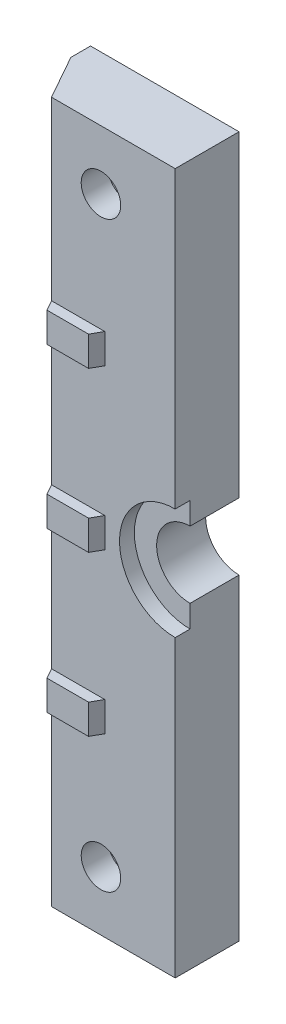
ISO-10303-21;
HEADER;
FILE_DESCRIPTION(('STEP AP214'),'2;1');
FILE_NAME('part.step','',(''),(''),'','','');
FILE_SCHEMA(('AUTOMOTIVE_DESIGN { 1 0 10303 214 1 1 1 1 }'));
ENDSEC;
DATA;
#1=APPLICATION_CONTEXT('core data for automotive mechanical design processes');
#2=APPLICATION_PROTOCOL_DEFINITION('international standard','automotive_design',2000,#1);
#3=PRODUCT_CONTEXT('',#1,'mechanical');
#4=PRODUCT('Part','Part','',(#3));
#5=PRODUCT_RELATED_PRODUCT_CATEGORY('part','',(#4));
#6=PRODUCT_DEFINITION_FORMATION('','',#4);
#7=PRODUCT_DEFINITION_CONTEXT('part definition',#1,'design');
#8=PRODUCT_DEFINITION('design','',#6,#7);
#9=PRODUCT_DEFINITION_SHAPE('','',#8);
#10=(LENGTH_UNIT() NAMED_UNIT(*) SI_UNIT(.MILLI.,.METRE.));
#11=(NAMED_UNIT(*) PLANE_ANGLE_UNIT() SI_UNIT($,.RADIAN.));
#12=(NAMED_UNIT(*) SI_UNIT($,.STERADIAN.) SOLID_ANGLE_UNIT());
#13=UNCERTAINTY_MEASURE_WITH_UNIT(LENGTH_MEASURE(1.E-05),#10,'distance_accuracy_value','');
#14=(GEOMETRIC_REPRESENTATION_CONTEXT(3) GLOBAL_UNCERTAINTY_ASSIGNED_CONTEXT((#13)) GLOBAL_UNIT_ASSIGNED_CONTEXT((#10,
#11,#12)) REPRESENTATION_CONTEXT('',''));
#15=CARTESIAN_POINT('',(0.,0.,0.));
#16=DIRECTION('',(0.,0.,1.));
#17=DIRECTION('',(1.,0.,0.));
#18=AXIS2_PLACEMENT_3D('',#15,#16,#17);
#19=CARTESIAN_POINT('',(0.,59.944,0.));
#20=DIRECTION('',(0.,0.,-1.));
#21=DIRECTION('',(-1.,0.,0.));
#22=AXIS2_PLACEMENT_3D('',#19,#20,#21);
#23=CYLINDRICAL_SURFACE('',#22,5.715);
#24=CARTESIAN_POINT('',(0.,59.944,-2.54));
#25=DIRECTION('',(0.,0.,1.));
#26=DIRECTION('',(1.,0.,0.));
#27=AXIS2_PLACEMENT_3D('',#24,#25,#26);
#28=CIRCLE('',#27,5.715);
#29=CARTESIAN_POINT('',(0.,54.229,-2.54));
#30=VERTEX_POINT('',#29);
#31=CARTESIAN_POINT('',(0.,65.659,-2.54));
#32=VERTEX_POINT('',#31);
#33=EDGE_CURVE('E54',#30,#32,#28,.F.);
#34=ORIENTED_EDGE('',*,*,#33,.F.);
#35=DIRECTION('',(0.,0.,-1.));
#36=VECTOR('',#35,1.);
#37=CARTESIAN_POINT('',(0.,54.229,0.));
#38=LINE('',#37,#36);
#39=CARTESIAN_POINT('',(0.,54.229,-10.922));
#40=VERTEX_POINT('',#39);
#41=EDGE_CURVE('E237',#40,#30,#38,.F.);
#42=ORIENTED_EDGE('',*,*,#41,.F.);
#43=CARTESIAN_POINT('',(0.,59.944,-10.922));
#44=DIRECTION('',(0.,0.,1.));
#45=DIRECTION('',(1.,0.,0.));
#46=AXIS2_PLACEMENT_3D('',#43,#44,#45);
#47=CIRCLE('',#46,5.715);
#48=CARTESIAN_POINT('',(0.,65.659,-10.922));
#49=VERTEX_POINT('',#48);
#50=EDGE_CURVE('E216',#49,#40,#47,.T.);
#51=ORIENTED_EDGE('',*,*,#50,.F.);
#52=DIRECTION('',(0.,0.,-1.));
#53=VECTOR('',#52,1.);
#54=CARTESIAN_POINT('',(0.,65.659,0.));
#55=LINE('',#54,#53);
#56=EDGE_CURVE('E230',#32,#49,#55,.T.);
#57=ORIENTED_EDGE('',*,*,#56,.F.);
#58=EDGE_LOOP('',(#34,#42,#51,#57));
#59=FACE_BOUND('',#58,.T.);
#60=ADVANCED_FACE('F45',(#59),#23,.F.);
#61=CARTESIAN_POINT('',(-21.1556739347085,119.888,0.));
#62=DIRECTION('',(0.,0.,-1.));
#63=DIRECTION('',(-1.,0.,0.));
#64=AXIS2_PLACEMENT_3D('',#61,#62,#63);
#65=PLANE('',#64);
#66=CARTESIAN_POINT('',(-12.7,109.77245,0.));
#67=DIRECTION('',(0.,0.,-1.));
#68=DIRECTION('',(-1.,0.,0.));
#69=AXIS2_PLACEMENT_3D('',#66,#67,#68);
#70=CIRCLE('',#69,3.3782);
#71=CARTESIAN_POINT('',(-16.0782,109.77245,0.));
#72=VERTEX_POINT('',#71);
#73=EDGE_CURVE('E271',#72,#72,#70,.T.);
#74=ORIENTED_EDGE('',*,*,#73,.T.);
#75=EDGE_LOOP('',(#74));
#76=FACE_BOUND('',#75,.T.);
#77=CARTESIAN_POINT('',(-12.7,10.11555,0.));
#78=DIRECTION('',(0.,0.,-1.));
#79=DIRECTION('',(-1.,0.,0.));
#80=AXIS2_PLACEMENT_3D('',#77,#78,#79);
#81=CIRCLE('',#80,3.3782);
#82=CARTESIAN_POINT('',(-16.0782,10.11555,0.));
#83=VERTEX_POINT('',#82);
#84=EDGE_CURVE('E255',#83,#83,#81,.T.);
#85=ORIENTED_EDGE('',*,*,#84,.T.);
#86=EDGE_LOOP('',(#85));
#87=FACE_BOUND('',#86,.T.);
#88=DIRECTION('',(0.,-1.,0.));
#89=VECTOR('',#88,1.);
#90=CARTESIAN_POINT('',(0.,119.888,0.));
#91=LINE('',#90,#89);
#92=CARTESIAN_POINT('',(0.,50.419,0.));
#93=VERTEX_POINT('',#92);
#94=CARTESIAN_POINT('',(0.,0.,0.));
#95=VERTEX_POINT('',#94);
#96=EDGE_CURVE('E208',#93,#95,#91,.T.);
#97=ORIENTED_EDGE('',*,*,#96,.F.);
#98=CARTESIAN_POINT('',(0.,59.944,0.));
#99=DIRECTION('',(0.,0.,1.));
#100=DIRECTION('',(1.,0.,0.));
#101=AXIS2_PLACEMENT_3D('',#98,#99,#100);
#102=CIRCLE('',#101,9.525);
#103=CARTESIAN_POINT('',(0.,69.469,0.));
#104=VERTEX_POINT('',#103);
#105=EDGE_CURVE('E194',#104,#93,#102,.T.);
#106=ORIENTED_EDGE('',*,*,#105,.F.);
#107=CARTESIAN_POINT('',(0.,119.888,0.));
#108=VERTEX_POINT('',#107);
#109=EDGE_CURVE('E206',#108,#104,#91,.T.);
#110=ORIENTED_EDGE('',*,*,#109,.F.);
#111=DIRECTION('',(1.,0.,0.));
#112=VECTOR('',#111,1.);
#113=CARTESIAN_POINT('',(-21.1556739347085,119.888,0.));
#114=LINE('',#113,#112);
#115=CARTESIAN_POINT('',(-21.1556739347085,119.888,0.));
#116=VERTEX_POINT('',#115);
#117=EDGE_CURVE('E276',#116,#108,#114,.T.);
#118=ORIENTED_EDGE('',*,*,#117,.F.);
#119=DIRECTION('',(0.,-1.,0.));
#120=VECTOR('',#119,1.);
#121=CARTESIAN_POINT('',(-21.1556739347085,119.888,0.));
#122=LINE('',#121,#120);
#123=CARTESIAN_POINT('',(-21.1556739347085,89.7382,0.));
#124=VERTEX_POINT('',#123);
#125=EDGE_CURVE('E307',#116,#124,#122,.T.);
#126=ORIENTED_EDGE('',*,*,#125,.T.);
#127=DIRECTION('',(-1.,0.,0.));
#128=VECTOR('',#127,1.);
#129=CARTESIAN_POINT('',(-21.1556739347085,89.7382,0.));
#130=LINE('',#129,#128);
#131=CARTESIAN_POINT('',(-12.0463440216302,89.7382,0.));
#132=VERTEX_POINT('',#131);
#133=EDGE_CURVE('E336',#132,#124,#130,.T.);
#134=ORIENTED_EDGE('',*,*,#133,.F.);
#135=DIRECTION('',(0.,1.,0.));
#136=VECTOR('',#135,1.);
#137=CARTESIAN_POINT('',(-12.0463440216302,84.6582,0.));
#138=LINE('',#137,#136);
#139=CARTESIAN_POINT('',(-12.0463440216302,84.6582,0.));
#140=VERTEX_POINT('',#139);
#141=EDGE_CURVE('E69',#140,#132,#138,.T.);
#142=ORIENTED_EDGE('',*,*,#141,.F.);
#143=DIRECTION('',(-1.,0.,0.));
#144=VECTOR('',#143,1.);
#145=CARTESIAN_POINT('',(-21.1556739347085,84.6582,0.));
#146=LINE('',#145,#144);
#147=CARTESIAN_POINT('',(-21.1556739347085,84.6582,0.));
#148=VERTEX_POINT('',#147);
#149=EDGE_CURVE('E365',#140,#148,#146,.T.);
#150=ORIENTED_EDGE('',*,*,#149,.T.);
#151=CARTESIAN_POINT('',(-21.1556739347085,62.484,0.));
#152=VERTEX_POINT('',#151);
#153=EDGE_CURVE('E311',#148,#152,#122,.T.);
#154=ORIENTED_EDGE('',*,*,#153,.T.);
#155=DIRECTION('',(-1.,0.,0.));
#156=VECTOR('',#155,1.);
#157=CARTESIAN_POINT('',(-21.1556739347085,62.484,0.));
#158=LINE('',#157,#156);
#159=CARTESIAN_POINT('',(-12.0463440216302,62.484,0.));
#160=VERTEX_POINT('',#159);
#161=EDGE_CURVE('E381',#160,#152,#158,.T.);
#162=ORIENTED_EDGE('',*,*,#161,.F.);
#163=DIRECTION('',(0.,1.,0.));
#164=VECTOR('',#163,1.);
#165=CARTESIAN_POINT('',(-12.0463440216302,57.404,0.));
#166=LINE('',#165,#164);
#167=CARTESIAN_POINT('',(-12.0463440216302,57.404,0.));
#168=VERTEX_POINT('',#167);
#169=EDGE_CURVE('E244',#168,#160,#166,.T.);
#170=ORIENTED_EDGE('',*,*,#169,.F.);
#171=DIRECTION('',(-1.,0.,0.));
#172=VECTOR('',#171,1.);
#173=CARTESIAN_POINT('',(-21.1556739347085,57.404,0.));
#174=LINE('',#173,#172);
#175=CARTESIAN_POINT('',(-21.1556739347085,57.404,0.));
#176=VERTEX_POINT('',#175);
#177=EDGE_CURVE('E438',#168,#176,#174,.T.);
#178=ORIENTED_EDGE('',*,*,#177,.T.);
#179=CARTESIAN_POINT('',(-21.1556739347085,35.2298,0.));
#180=VERTEX_POINT('',#179);
#181=EDGE_CURVE('E312',#176,#180,#122,.T.);
#182=ORIENTED_EDGE('',*,*,#181,.T.);
#183=DIRECTION('',(-1.,0.,0.));
#184=VECTOR('',#183,1.);
#185=CARTESIAN_POINT('',(-21.1556739347085,35.2298,0.));
#186=LINE('',#185,#184);
#187=CARTESIAN_POINT('',(-12.0463440216302,35.2298,0.));
#188=VERTEX_POINT('',#187);
#189=EDGE_CURVE('E200',#188,#180,#186,.T.);
#190=ORIENTED_EDGE('',*,*,#189,.F.);
#191=DIRECTION('',(0.,1.,0.));
#192=VECTOR('',#191,1.);
#193=CARTESIAN_POINT('',(-12.0463440216302,30.1498,0.));
#194=LINE('',#193,#192);
#195=CARTESIAN_POINT('',(-12.0463440216302,30.1498,0.));
#196=VERTEX_POINT('',#195);
#197=EDGE_CURVE('E354',#196,#188,#194,.T.);
#198=ORIENTED_EDGE('',*,*,#197,.F.);
#199=DIRECTION('',(-1.,0.,0.));
#200=VECTOR('',#199,1.);
#201=CARTESIAN_POINT('',(-21.1556739347085,30.1498,0.));
#202=LINE('',#201,#200);
#203=CARTESIAN_POINT('',(-21.1556739347085,30.1498,0.));
#204=VERTEX_POINT('',#203);
#205=EDGE_CURVE('E402',#196,#204,#202,.T.);
#206=ORIENTED_EDGE('',*,*,#205,.T.);
#207=CARTESIAN_POINT('',(-21.1556739347085,0.,0.));
#208=VERTEX_POINT('',#207);
#209=EDGE_CURVE('E291',#204,#208,#122,.T.);
#210=ORIENTED_EDGE('',*,*,#209,.T.);
#211=DIRECTION('',(1.,0.,0.));
#212=VECTOR('',#211,1.);
#213=CARTESIAN_POINT('',(-21.1556739347085,0.,0.));
#214=LINE('',#213,#212);
#215=EDGE_CURVE('E275',#208,#95,#214,.T.);
#216=ORIENTED_EDGE('',*,*,#215,.T.);
#217=EDGE_LOOP('',(#97,#106,#110,#118,#126,#134,#142,#150,#154,#162,#170,#178,#182,#190,#198,
#206,#210,#216));
#218=FACE_BOUND('',#217,.T.);
#219=ADVANCED_FACE('F47',(#76,#87,#218),#65,.F.);
#220=CARTESIAN_POINT('',(0.,119.888,0.));
#221=DIRECTION('',(-1.,0.,0.));
#222=DIRECTION('',(0.,0.,1.));
#223=AXIS2_PLACEMENT_3D('',#220,#221,#222);
#224=PLANE('',#223);
#225=ORIENTED_EDGE('',*,*,#109,.T.);
#226=DIRECTION('',(0.,0.,1.));
#227=VECTOR('',#226,1.);
#228=CARTESIAN_POINT('',(0.,69.469,-2.54));
#229=LINE('',#228,#227);
#230=CARTESIAN_POINT('',(0.,69.469,-2.54));
#231=VERTEX_POINT('',#230);
#232=EDGE_CURVE('E191',#104,#231,#229,.F.);
#233=ORIENTED_EDGE('',*,*,#232,.T.);
#234=DIRECTION('',(0.,1.,0.));
#235=VECTOR('',#234,1.);
#236=CARTESIAN_POINT('',(0.,119.888,-2.54));
#237=LINE('',#236,#235);
#238=EDGE_CURVE('E201',#32,#231,#237,.T.);
#239=ORIENTED_EDGE('',*,*,#238,.F.);
#240=ORIENTED_EDGE('',*,*,#56,.T.);
#241=DIRECTION('',(0.,-1.,0.));
#242=VECTOR('',#241,1.);
#243=CARTESIAN_POINT('',(0.,119.888,-10.922));
#244=LINE('',#243,#242);
#245=CARTESIAN_POINT('',(0.,119.888,-10.922));
#246=VERTEX_POINT('',#245);
#247=EDGE_CURVE('E222',#246,#49,#244,.T.);
#248=ORIENTED_EDGE('',*,*,#247,.F.);
#249=DIRECTION('',(0.,0.,-1.));
#250=VECTOR('',#249,1.);
#251=CARTESIAN_POINT('',(0.,119.888,0.));
#252=LINE('',#251,#250);
#253=EDGE_CURVE('E213',#108,#246,#252,.T.);
#254=ORIENTED_EDGE('',*,*,#253,.F.);
#255=EDGE_LOOP('',(#225,#233,#239,#240,#248,#254));
#256=FACE_BOUND('',#255,.T.);
#257=ADVANCED_FACE('F211',(#256),#224,.F.);
#258=DIRECTION('',(0.,1.,0.));
#259=VECTOR('',#258,1.);
#260=CARTESIAN_POINT('',(0.,119.888,-2.54));
#261=LINE('',#260,#259);
#262=CARTESIAN_POINT('',(0.,50.419,-2.54));
#263=VERTEX_POINT('',#262);
#264=EDGE_CURVE('E61',#263,#30,#261,.T.);
#265=ORIENTED_EDGE('',*,*,#264,.F.);
#266=DIRECTION('',(0.,0.,1.));
#267=VECTOR('',#266,1.);
#268=CARTESIAN_POINT('',(0.,50.419,-2.54));
#269=LINE('',#268,#267);
#270=EDGE_CURVE('E11',#263,#93,#269,.T.);
#271=ORIENTED_EDGE('',*,*,#270,.T.);
#272=ORIENTED_EDGE('',*,*,#96,.T.);
#273=DIRECTION('',(0.,0.,-1.));
#274=VECTOR('',#273,1.);
#275=CARTESIAN_POINT('',(0.,0.,0.));
#276=LINE('',#275,#274);
#277=CARTESIAN_POINT('',(0.,0.,-10.922));
#278=VERTEX_POINT('',#277);
#279=EDGE_CURVE('E294',#95,#278,#276,.T.);
#280=ORIENTED_EDGE('',*,*,#279,.T.);
#281=EDGE_CURVE('E318',#40,#278,#244,.T.);
#282=ORIENTED_EDGE('',*,*,#281,.F.);
#283=ORIENTED_EDGE('',*,*,#41,.T.);
#284=EDGE_LOOP('',(#265,#271,#272,#280,#282,#283));
#285=FACE_BOUND('',#284,.T.);
#286=ADVANCED_FACE('F487',(#285),#224,.F.);
#287=CARTESIAN_POINT('',(0.,119.888,-10.922));
#288=DIRECTION('',(0.,0.,1.));
#289=DIRECTION('',(1.,0.,0.));
#290=AXIS2_PLACEMENT_3D('',#287,#288,#289);
#291=PLANE('',#290);
#292=CARTESIAN_POINT('',(-12.7,10.11555,-10.922));
#293=DIRECTION('',(0.,0.,-1.));
#294=DIRECTION('',(-1.,0.,0.));
#295=AXIS2_PLACEMENT_3D('',#292,#293,#294);
#296=CIRCLE('',#295,5.55625);
#297=CARTESIAN_POINT('',(-18.25625,10.11555,-10.922));
#298=VERTEX_POINT('',#297);
#299=EDGE_CURVE('E236',#298,#298,#296,.T.);
#300=ORIENTED_EDGE('',*,*,#299,.F.);
#301=EDGE_LOOP('',(#300));
#302=FACE_BOUND('',#301,.T.);
#303=CARTESIAN_POINT('',(-12.7,109.77245,-10.922));
#304=DIRECTION('',(0.,0.,-1.));
#305=DIRECTION('',(-1.,0.,0.));
#306=AXIS2_PLACEMENT_3D('',#303,#304,#305);
#307=CIRCLE('',#306,5.55625);
#308=CARTESIAN_POINT('',(-18.25625,109.77245,-10.922));
#309=VERTEX_POINT('',#308);
#310=EDGE_CURVE('E259',#309,#309,#307,.T.);
#311=ORIENTED_EDGE('',*,*,#310,.F.);
#312=EDGE_LOOP('',(#311));
#313=FACE_BOUND('',#312,.T.);
#314=ORIENTED_EDGE('',*,*,#247,.T.);
#315=ORIENTED_EDGE('',*,*,#50,.T.);
#316=ORIENTED_EDGE('',*,*,#281,.T.);
#317=DIRECTION('',(-1.,0.,0.));
#318=VECTOR('',#317,1.);
#319=CARTESIAN_POINT('',(0.,0.,-10.922));
#320=LINE('',#319,#318);
#321=CARTESIAN_POINT('',(-25.4,0.,-10.922));
#322=VERTEX_POINT('',#321);
#323=EDGE_CURVE('E298',#278,#322,#320,.T.);
#324=ORIENTED_EDGE('',*,*,#323,.T.);
#325=DIRECTION('',(0.,-1.,0.));
#326=VECTOR('',#325,1.);
#327=CARTESIAN_POINT('',(-25.4,119.888,-10.922));
#328=LINE('',#327,#326);
#329=CARTESIAN_POINT('',(-25.4,119.888,-10.922));
#330=VERTEX_POINT('',#329);
#331=EDGE_CURVE('E315',#330,#322,#328,.T.);
#332=ORIENTED_EDGE('',*,*,#331,.F.);
#333=DIRECTION('',(-1.,0.,0.));
#334=VECTOR('',#333,1.);
#335=CARTESIAN_POINT('',(0.,119.888,-10.922));
#336=LINE('',#335,#334);
#337=EDGE_CURVE('E282',#246,#330,#336,.T.);
#338=ORIENTED_EDGE('',*,*,#337,.F.);
#339=EDGE_LOOP('',(#314,#315,#316,#324,#332,#338));
#340=FACE_BOUND('',#339,.T.);
#341=ADVANCED_FACE('F328',(#302,#313,#340),#291,.F.);
#342=CARTESIAN_POINT('',(-25.4,119.888,-10.922));
#343=DIRECTION('',(1.,0.,0.));
#344=DIRECTION('',(0.,0.,-1.));
#345=AXIS2_PLACEMENT_3D('',#342,#343,#344);
#346=PLANE('',#345);
#347=DIRECTION('',(0.,0.,1.));
#348=VECTOR('',#347,1.);
#349=CARTESIAN_POINT('',(-25.4,0.,-10.922));
#350=LINE('',#349,#348);
#351=CARTESIAN_POINT('',(-25.4,0.,-7.5565));
#352=VERTEX_POINT('',#351);
#353=EDGE_CURVE('E301',#322,#352,#350,.T.);
#354=ORIENTED_EDGE('',*,*,#353,.T.);
#355=DIRECTION('',(0.,-1.,0.));
#356=VECTOR('',#355,1.);
#357=CARTESIAN_POINT('',(-25.4,119.888,-7.5565));
#358=LINE('',#357,#356);
#359=CARTESIAN_POINT('',(-25.4,119.888,-7.5565));
#360=VERTEX_POINT('',#359);
#361=EDGE_CURVE('E310',#360,#352,#358,.T.);
#362=ORIENTED_EDGE('',*,*,#361,.F.);
#363=DIRECTION('',(0.,0.,1.));
#364=VECTOR('',#363,1.);
#365=CARTESIAN_POINT('',(-25.4,119.888,-10.922));
#366=LINE('',#365,#364);
#367=EDGE_CURVE('E285',#330,#360,#366,.T.);
#368=ORIENTED_EDGE('',*,*,#367,.F.);
#369=ORIENTED_EDGE('',*,*,#331,.T.);
#370=EDGE_LOOP('',(#354,#362,#368,#369));
#371=FACE_BOUND('',#370,.T.);
#372=ADVANCED_FACE('F498',(#371),#346,.F.);
#373=CARTESIAN_POINT('',(-25.4,119.888,-7.5565));
#374=DIRECTION('',(0.871881298778186,0.,-0.489717266227018));
#375=DIRECTION('',(-0.489717266227018,0.,-0.871881298778186));
#376=AXIS2_PLACEMENT_3D('',#373,#374,#375);
#377=PLANE('',#376);
#378=DIRECTION('',(0.489717266227018,0.,0.871881298778186));
#379=VECTOR('',#378,1.);
#380=CARTESIAN_POINT('',(-25.4,0.,-7.5565));
#381=LINE('',#380,#379);
#382=EDGE_CURVE('E279',#352,#208,#381,.T.);
#383=ORIENTED_EDGE('',*,*,#382,.T.);
#384=ORIENTED_EDGE('',*,*,#209,.F.);
#385=DIRECTION('',(0.489717266227017,0.,0.871881298778186));
#386=VECTOR('',#385,1.);
#387=CARTESIAN_POINT('',(-21.1556739347085,30.1498,0.));
#388=LINE('',#387,#386);
#389=CARTESIAN_POINT('',(-20.1570089781693,30.1498,1.778));
#390=VERTEX_POINT('',#389);
#391=EDGE_CURVE('E406',#204,#390,#388,.T.);
#392=ORIENTED_EDGE('',*,*,#391,.T.);
#393=DIRECTION('',(0.,1.,0.));
#394=VECTOR('',#393,1.);
#395=CARTESIAN_POINT('',(-20.1570089781693,30.1498,1.778));
#396=LINE('',#395,#394);
#397=CARTESIAN_POINT('',(-20.1570089781693,35.2298,1.778));
#398=VERTEX_POINT('',#397);
#399=EDGE_CURVE('E417',#390,#398,#396,.T.);
#400=ORIENTED_EDGE('',*,*,#399,.T.);
#401=DIRECTION('',(0.489717266227017,0.,0.871881298778186));
#402=VECTOR('',#401,1.);
#403=CARTESIAN_POINT('',(-21.1556739347085,35.2298,0.));
#404=LINE('',#403,#402);
#405=EDGE_CURVE('E390',#180,#398,#404,.T.);
#406=ORIENTED_EDGE('',*,*,#405,.F.);
#407=ORIENTED_EDGE('',*,*,#181,.F.);
#408=DIRECTION('',(0.489717266227017,0.,0.871881298778186));
#409=VECTOR('',#408,1.);
#410=CARTESIAN_POINT('',(-21.1556739347085,57.404,0.));
#411=LINE('',#410,#409);
#412=CARTESIAN_POINT('',(-20.1570089781693,57.404,1.778));
#413=VERTEX_POINT('',#412);
#414=EDGE_CURVE('E442',#176,#413,#411,.T.);
#415=ORIENTED_EDGE('',*,*,#414,.T.);
#416=DIRECTION('',(0.,1.,0.));
#417=VECTOR('',#416,1.);
#418=CARTESIAN_POINT('',(-20.1570089781693,57.404,1.778));
#419=LINE('',#418,#417);
#420=CARTESIAN_POINT('',(-20.1570089781693,62.484,1.778));
#421=VERTEX_POINT('',#420);
#422=EDGE_CURVE('E454',#413,#421,#419,.T.);
#423=ORIENTED_EDGE('',*,*,#422,.T.);
#424=DIRECTION('',(0.489717266227017,0.,0.871881298778186));
#425=VECTOR('',#424,1.);
#426=CARTESIAN_POINT('',(-21.1556739347085,62.484,0.));
#427=LINE('',#426,#425);
#428=EDGE_CURVE('E426',#152,#421,#427,.T.);
#429=ORIENTED_EDGE('',*,*,#428,.F.);
#430=ORIENTED_EDGE('',*,*,#153,.F.);
#431=DIRECTION('',(0.489717266227017,0.,0.871881298778186));
#432=VECTOR('',#431,1.);
#433=CARTESIAN_POINT('',(-21.1556739347085,84.6582,0.));
#434=LINE('',#433,#432);
#435=CARTESIAN_POINT('',(-20.1570089781693,84.6582,1.778));
#436=VERTEX_POINT('',#435);
#437=EDGE_CURVE('E368',#148,#436,#434,.T.);
#438=ORIENTED_EDGE('',*,*,#437,.T.);
#439=DIRECTION('',(0.,1.,0.));
#440=VECTOR('',#439,1.);
#441=CARTESIAN_POINT('',(-20.1570089781693,84.6582,1.778));
#442=LINE('',#441,#440);
#443=CARTESIAN_POINT('',(-20.1570089781693,89.7382,1.778));
#444=VERTEX_POINT('',#443);
#445=EDGE_CURVE('E342',#436,#444,#442,.T.);
#446=ORIENTED_EDGE('',*,*,#445,.T.);
#447=DIRECTION('',(0.489717266227017,0.,0.871881298778186));
#448=VECTOR('',#447,1.);
#449=CARTESIAN_POINT('',(-21.1556739347085,89.7382,0.));
#450=LINE('',#449,#448);
#451=EDGE_CURVE('E339',#124,#444,#450,.T.);
#452=ORIENTED_EDGE('',*,*,#451,.F.);
#453=ORIENTED_EDGE('',*,*,#125,.F.);
#454=DIRECTION('',(0.489717266227018,0.,0.871881298778186));
#455=VECTOR('',#454,1.);
#456=CARTESIAN_POINT('',(-25.4,119.888,-7.5565));
#457=LINE('',#456,#455);
#458=EDGE_CURVE('E288',#360,#116,#457,.T.);
#459=ORIENTED_EDGE('',*,*,#458,.F.);
#460=ORIENTED_EDGE('',*,*,#361,.T.);
#461=EDGE_LOOP('',(#383,#384,#392,#400,#406,#407,#415,#423,#429,#430,#438,#446,#452,#453,#459,#460));
#462=FACE_BOUND('',#461,.T.);
#463=ADVANCED_FACE('F340',(#462),#377,.F.);
#464=CARTESIAN_POINT('',(0.,119.888,0.));
#465=DIRECTION('',(0.,1.,0.));
#466=DIRECTION('',(0.,0.,1.));
#467=AXIS2_PLACEMENT_3D('',#464,#465,#466);
#468=PLANE('',#467);
#469=ORIENTED_EDGE('',*,*,#117,.T.);
#470=ORIENTED_EDGE('',*,*,#253,.T.);
#471=ORIENTED_EDGE('',*,*,#337,.T.);
#472=ORIENTED_EDGE('',*,*,#367,.T.);
#473=ORIENTED_EDGE('',*,*,#458,.T.);
#474=EDGE_LOOP('',(#469,#470,#471,#472,#473));
#475=FACE_BOUND('',#474,.T.);
#476=ADVANCED_FACE('F330',(#475),#468,.T.);
#477=CARTESIAN_POINT('',(0.,0.,0.));
#478=DIRECTION('',(0.,1.,0.));
#479=DIRECTION('',(0.,0.,1.));
#480=AXIS2_PLACEMENT_3D('',#477,#478,#479);
#481=PLANE('',#480);
#482=ORIENTED_EDGE('',*,*,#215,.F.);
#483=ORIENTED_EDGE('',*,*,#382,.F.);
#484=ORIENTED_EDGE('',*,*,#353,.F.);
#485=ORIENTED_EDGE('',*,*,#323,.F.);
#486=ORIENTED_EDGE('',*,*,#279,.F.);
#487=EDGE_LOOP('',(#482,#483,#484,#485,#486));
#488=FACE_BOUND('',#487,.T.);
#489=ADVANCED_FACE('F484',(#488),#481,.F.);
#490=CARTESIAN_POINT('',(-12.7,109.77245,-10.922));
#491=DIRECTION('',(0.,0.,-1.));
#492=DIRECTION('',(-1.,0.,0.));
#493=AXIS2_PLACEMENT_3D('',#490,#491,#492);
#494=CYLINDRICAL_SURFACE('',#493,3.3782);
#495=ORIENTED_EDGE('',*,*,#73,.F.);
#496=EDGE_LOOP('',(#495));
#497=FACE_BOUND('',#496,.T.);
#498=CARTESIAN_POINT('',(-12.7,109.77245,-4.572));
#499=DIRECTION('',(0.,0.,-1.));
#500=DIRECTION('',(-1.,0.,0.));
#501=AXIS2_PLACEMENT_3D('',#498,#499,#500);
#502=CIRCLE('',#501,3.3782);
#503=CARTESIAN_POINT('',(-16.0782,109.77245,-4.572));
#504=VERTEX_POINT('',#503);
#505=EDGE_CURVE('E267',#504,#504,#502,.T.);
#506=ORIENTED_EDGE('',*,*,#505,.T.);
#507=EDGE_LOOP('',(#506));
#508=FACE_BOUND('',#507,.T.);
#509=ADVANCED_FACE('F530',(#497,#508),#494,.F.);
#510=CARTESIAN_POINT('',(-9.3218,109.77245,-4.572));
#511=DIRECTION('',(0.,0.,1.));
#512=DIRECTION('',(1.,0.,0.));
#513=AXIS2_PLACEMENT_3D('',#510,#511,#512);
#514=PLANE('',#513);
#515=ORIENTED_EDGE('',*,*,#505,.F.);
#516=EDGE_LOOP('',(#515));
#517=FACE_BOUND('',#516,.T.);
#518=CARTESIAN_POINT('',(-12.7,109.77245,-4.572));
#519=DIRECTION('',(0.,0.,-1.));
#520=DIRECTION('',(-1.,0.,0.));
#521=AXIS2_PLACEMENT_3D('',#518,#519,#520);
#522=CIRCLE('',#521,5.55625);
#523=CARTESIAN_POINT('',(-18.25625,109.77245,-4.572));
#524=VERTEX_POINT('',#523);
#525=EDGE_CURVE('E263',#524,#524,#522,.T.);
#526=ORIENTED_EDGE('',*,*,#525,.T.);
#527=EDGE_LOOP('',(#526));
#528=FACE_BOUND('',#527,.T.);
#529=ADVANCED_FACE('F526',(#517,#528),#514,.F.);
#530=CARTESIAN_POINT('',(-12.7,109.77245,-10.922));
#531=DIRECTION('',(0.,0.,-1.));
#532=DIRECTION('',(-1.,0.,0.));
#533=AXIS2_PLACEMENT_3D('',#530,#531,#532);
#534=CYLINDRICAL_SURFACE('',#533,5.55625);
#535=ORIENTED_EDGE('',*,*,#525,.F.);
#536=EDGE_LOOP('',(#535));
#537=FACE_BOUND('',#536,.T.);
#538=ORIENTED_EDGE('',*,*,#310,.T.);
#539=EDGE_LOOP('',(#538));
#540=FACE_BOUND('',#539,.T.);
#541=ADVANCED_FACE('F522',(#537,#540),#534,.F.);
#542=CARTESIAN_POINT('',(-12.7,10.11555,-10.922));
#543=DIRECTION('',(0.,0.,-1.));
#544=DIRECTION('',(-1.,0.,0.));
#545=AXIS2_PLACEMENT_3D('',#542,#543,#544);
#546=CYLINDRICAL_SURFACE('',#545,3.3782);
#547=ORIENTED_EDGE('',*,*,#84,.F.);
#548=EDGE_LOOP('',(#547));
#549=FACE_BOUND('',#548,.T.);
#550=CARTESIAN_POINT('',(-12.7,10.11555,-4.572));
#551=DIRECTION('',(0.,0.,-1.));
#552=DIRECTION('',(-1.,0.,0.));
#553=AXIS2_PLACEMENT_3D('',#550,#551,#552);
#554=CIRCLE('',#553,3.3782);
#555=CARTESIAN_POINT('',(-16.0782,10.11555,-4.572));
#556=VERTEX_POINT('',#555);
#557=EDGE_CURVE('E251',#556,#556,#554,.T.);
#558=ORIENTED_EDGE('',*,*,#557,.T.);
#559=EDGE_LOOP('',(#558));
#560=FACE_BOUND('',#559,.T.);
#561=ADVANCED_FACE('F518',(#549,#560),#546,.F.);
#562=CARTESIAN_POINT('',(-9.3218,10.11555,-4.572));
#563=DIRECTION('',(0.,0.,1.));
#564=DIRECTION('',(1.,0.,0.));
#565=AXIS2_PLACEMENT_3D('',#562,#563,#564);
#566=PLANE('',#565);
#567=ORIENTED_EDGE('',*,*,#557,.F.);
#568=EDGE_LOOP('',(#567));
#569=FACE_BOUND('',#568,.T.);
#570=CARTESIAN_POINT('',(-12.7,10.11555,-4.572));
#571=DIRECTION('',(0.,0.,-1.));
#572=DIRECTION('',(-1.,0.,0.));
#573=AXIS2_PLACEMENT_3D('',#570,#571,#572);
#574=CIRCLE('',#573,5.55625);
#575=CARTESIAN_POINT('',(-18.25625,10.11555,-4.572));
#576=VERTEX_POINT('',#575);
#577=EDGE_CURVE('E242',#576,#576,#574,.T.);
#578=ORIENTED_EDGE('',*,*,#577,.T.);
#579=EDGE_LOOP('',(#578));
#580=FACE_BOUND('',#579,.T.);
#581=ADVANCED_FACE('F514',(#569,#580),#566,.F.);
#582=CARTESIAN_POINT('',(-12.7,10.11555,-10.922));
#583=DIRECTION('',(0.,0.,-1.));
#584=DIRECTION('',(-1.,0.,0.));
#585=AXIS2_PLACEMENT_3D('',#582,#583,#584);
#586=CYLINDRICAL_SURFACE('',#585,5.55625);
#587=ORIENTED_EDGE('',*,*,#577,.F.);
#588=EDGE_LOOP('',(#587));
#589=FACE_BOUND('',#588,.T.);
#590=ORIENTED_EDGE('',*,*,#299,.T.);
#591=EDGE_LOOP('',(#590));
#592=FACE_BOUND('',#591,.T.);
#593=ADVANCED_FACE('F511',(#589,#592),#586,.F.);
#594=CARTESIAN_POINT('',(-12.0463440216302,57.404,0.));
#595=DIRECTION('',(0.871881298778186,0.,0.489717266227017));
#596=DIRECTION('',(0.489717266227017,0.,-0.871881298778186));
#597=AXIS2_PLACEMENT_3D('',#594,#595,#596);
#598=PLANE('',#597);
#599=ORIENTED_EDGE('',*,*,#169,.T.);
#600=DIRECTION('',(0.489717266227017,0.,-0.871881298778186));
#601=VECTOR('',#600,1.);
#602=CARTESIAN_POINT('',(-12.0463440216302,62.484,0.));
#603=LINE('',#602,#601);
#604=CARTESIAN_POINT('',(-13.0450089781693,62.484,1.778));
#605=VERTEX_POINT('',#604);
#606=EDGE_CURVE('E434',#605,#160,#603,.T.);
#607=ORIENTED_EDGE('',*,*,#606,.F.);
#608=DIRECTION('',(0.,1.,0.));
#609=VECTOR('',#608,1.);
#610=CARTESIAN_POINT('',(-13.0450089781693,57.404,1.778));
#611=LINE('',#610,#609);
#612=CARTESIAN_POINT('',(-13.0450089781693,57.404,1.778));
#613=VERTEX_POINT('',#612);
#614=EDGE_CURVE('E457',#613,#605,#611,.T.);
#615=ORIENTED_EDGE('',*,*,#614,.F.);
#616=DIRECTION('',(0.489717266227017,0.,-0.871881298778186));
#617=VECTOR('',#616,1.);
#618=CARTESIAN_POINT('',(-12.0463440216302,57.404,0.));
#619=LINE('',#618,#617);
#620=EDGE_CURVE('E450',#613,#168,#619,.T.);
#621=ORIENTED_EDGE('',*,*,#620,.T.);
#622=EDGE_LOOP('',(#599,#607,#615,#621));
#623=FACE_BOUND('',#622,.T.);
#624=ADVANCED_FACE('F472',(#623),#598,.T.);
#625=CARTESIAN_POINT('',(-20.1570089781693,57.404,1.778));
#626=DIRECTION('',(0.,0.,1.));
#627=DIRECTION('',(1.,0.,0.));
#628=AXIS2_PLACEMENT_3D('',#625,#626,#627);
#629=PLANE('',#628);
#630=ORIENTED_EDGE('',*,*,#614,.T.);
#631=DIRECTION('',(1.,0.,0.));
#632=VECTOR('',#631,1.);
#633=CARTESIAN_POINT('',(-20.1570089781693,62.484,1.778));
#634=LINE('',#633,#632);
#635=EDGE_CURVE('E430',#421,#605,#634,.T.);
#636=ORIENTED_EDGE('',*,*,#635,.F.);
#637=ORIENTED_EDGE('',*,*,#422,.F.);
#638=DIRECTION('',(1.,0.,0.));
#639=VECTOR('',#638,1.);
#640=CARTESIAN_POINT('',(-20.1570089781693,57.404,1.778));
#641=LINE('',#640,#639);
#642=EDGE_CURVE('E446',#413,#613,#641,.T.);
#643=ORIENTED_EDGE('',*,*,#642,.T.);
#644=EDGE_LOOP('',(#630,#636,#637,#643));
#645=FACE_BOUND('',#644,.T.);
#646=ADVANCED_FACE('F469',(#645),#629,.T.);
#647=CARTESIAN_POINT('',(0.,57.404,0.));
#648=DIRECTION('',(0.,-1.,0.));
#649=DIRECTION('',(0.,0.,-1.));
#650=AXIS2_PLACEMENT_3D('',#647,#648,#649);
#651=PLANE('',#650);
#652=ORIENTED_EDGE('',*,*,#177,.F.);
#653=ORIENTED_EDGE('',*,*,#620,.F.);
#654=ORIENTED_EDGE('',*,*,#642,.F.);
#655=ORIENTED_EDGE('',*,*,#414,.F.);
#656=EDGE_LOOP('',(#652,#653,#654,#655));
#657=FACE_BOUND('',#656,.T.);
#658=ADVANCED_FACE('F605',(#657),#651,.T.);
#659=CARTESIAN_POINT('',(0.,62.484,0.));
#660=DIRECTION('',(0.,-1.,0.));
#661=DIRECTION('',(0.,0.,-1.));
#662=AXIS2_PLACEMENT_3D('',#659,#660,#661);
#663=PLANE('',#662);
#664=ORIENTED_EDGE('',*,*,#161,.T.);
#665=ORIENTED_EDGE('',*,*,#428,.T.);
#666=ORIENTED_EDGE('',*,*,#635,.T.);
#667=ORIENTED_EDGE('',*,*,#606,.T.);
#668=EDGE_LOOP('',(#664,#665,#666,#667));
#669=FACE_BOUND('',#668,.T.);
#670=ADVANCED_FACE('F466',(#669),#663,.F.);
#671=CARTESIAN_POINT('',(-12.0463440216302,30.1498,0.));
#672=DIRECTION('',(0.871881298778186,0.,0.489717266227017));
#673=DIRECTION('',(0.489717266227017,0.,-0.871881298778186));
#674=AXIS2_PLACEMENT_3D('',#671,#672,#673);
#675=PLANE('',#674);
#676=ORIENTED_EDGE('',*,*,#197,.T.);
#677=DIRECTION('',(0.489717266227017,0.,-0.871881298778186));
#678=VECTOR('',#677,1.);
#679=CARTESIAN_POINT('',(-12.0463440216302,35.2298,0.));
#680=LINE('',#679,#678);
#681=CARTESIAN_POINT('',(-13.0450089781693,35.2298,1.778));
#682=VERTEX_POINT('',#681);
#683=EDGE_CURVE('E398',#682,#188,#680,.T.);
#684=ORIENTED_EDGE('',*,*,#683,.F.);
#685=DIRECTION('',(0.,1.,0.));
#686=VECTOR('',#685,1.);
#687=CARTESIAN_POINT('',(-13.0450089781693,30.1498,1.778));
#688=LINE('',#687,#686);
#689=CARTESIAN_POINT('',(-13.0450089781693,30.1498,1.778));
#690=VERTEX_POINT('',#689);
#691=EDGE_CURVE('E358',#690,#682,#688,.T.);
#692=ORIENTED_EDGE('',*,*,#691,.F.);
#693=DIRECTION('',(0.489717266227017,0.,-0.871881298778186));
#694=VECTOR('',#693,1.);
#695=CARTESIAN_POINT('',(-12.0463440216302,30.1498,0.));
#696=LINE('',#695,#694);
#697=EDGE_CURVE('E414',#690,#196,#696,.T.);
#698=ORIENTED_EDGE('',*,*,#697,.T.);
#699=EDGE_LOOP('',(#676,#684,#692,#698));
#700=FACE_BOUND('',#699,.T.);
#701=ADVANCED_FACE('F619',(#700),#675,.T.);
#702=CARTESIAN_POINT('',(-20.1570089781693,30.1498,1.778));
#703=DIRECTION('',(0.,0.,1.));
#704=DIRECTION('',(1.,0.,0.));
#705=AXIS2_PLACEMENT_3D('',#702,#703,#704);
#706=PLANE('',#705);
#707=ORIENTED_EDGE('',*,*,#691,.T.);
#708=DIRECTION('',(1.,0.,0.));
#709=VECTOR('',#708,1.);
#710=CARTESIAN_POINT('',(-20.1570089781693,35.2298,1.778));
#711=LINE('',#710,#709);
#712=EDGE_CURVE('E394',#398,#682,#711,.T.);
#713=ORIENTED_EDGE('',*,*,#712,.F.);
#714=ORIENTED_EDGE('',*,*,#399,.F.);
#715=DIRECTION('',(1.,0.,0.));
#716=VECTOR('',#715,1.);
#717=CARTESIAN_POINT('',(-20.1570089781693,30.1498,1.778));
#718=LINE('',#717,#716);
#719=EDGE_CURVE('E410',#390,#690,#718,.T.);
#720=ORIENTED_EDGE('',*,*,#719,.T.);
#721=EDGE_LOOP('',(#707,#713,#714,#720));
#722=FACE_BOUND('',#721,.T.);
#723=ADVANCED_FACE('F632',(#722),#706,.T.);
#724=CARTESIAN_POINT('',(0.,30.1498,0.));
#725=DIRECTION('',(0.,-1.,0.));
#726=DIRECTION('',(0.,0.,-1.));
#727=AXIS2_PLACEMENT_3D('',#724,#725,#726);
#728=PLANE('',#727);
#729=ORIENTED_EDGE('',*,*,#205,.F.);
#730=ORIENTED_EDGE('',*,*,#697,.F.);
#731=ORIENTED_EDGE('',*,*,#719,.F.);
#732=ORIENTED_EDGE('',*,*,#391,.F.);
#733=EDGE_LOOP('',(#729,#730,#731,#732));
#734=FACE_BOUND('',#733,.T.);
#735=ADVANCED_FACE('F641',(#734),#728,.T.);
#736=CARTESIAN_POINT('',(0.,35.2298,0.));
#737=DIRECTION('',(0.,-1.,0.));
#738=DIRECTION('',(0.,0.,-1.));
#739=AXIS2_PLACEMENT_3D('',#736,#737,#738);
#740=PLANE('',#739);
#741=ORIENTED_EDGE('',*,*,#189,.T.);
#742=ORIENTED_EDGE('',*,*,#405,.T.);
#743=ORIENTED_EDGE('',*,*,#712,.T.);
#744=ORIENTED_EDGE('',*,*,#683,.T.);
#745=EDGE_LOOP('',(#741,#742,#743,#744));
#746=FACE_BOUND('',#745,.T.);
#747=ADVANCED_FACE('F650',(#746),#740,.F.);
#748=CARTESIAN_POINT('',(-12.0463440216302,84.6582,0.));
#749=DIRECTION('',(0.871881298778186,0.,0.489717266227017));
#750=DIRECTION('',(0.489717266227017,0.,-0.871881298778186));
#751=AXIS2_PLACEMENT_3D('',#748,#749,#750);
#752=PLANE('',#751);
#753=ORIENTED_EDGE('',*,*,#141,.T.);
#754=DIRECTION('',(0.489717266227017,0.,-0.871881298778186));
#755=VECTOR('',#754,1.);
#756=CARTESIAN_POINT('',(-12.0463440216302,89.7382,0.));
#757=LINE('',#756,#755);
#758=CARTESIAN_POINT('',(-13.0450089781693,89.7382,1.778));
#759=VERTEX_POINT('',#758);
#760=EDGE_CURVE('E352',#759,#132,#757,.T.);
#761=ORIENTED_EDGE('',*,*,#760,.F.);
#762=DIRECTION('',(0.,1.,0.));
#763=VECTOR('',#762,1.);
#764=CARTESIAN_POINT('',(-13.0450089781693,84.6582,1.778));
#765=LINE('',#764,#763);
#766=CARTESIAN_POINT('',(-13.0450089781693,84.6582,1.778));
#767=VERTEX_POINT('',#766);
#768=EDGE_CURVE('E382',#767,#759,#765,.T.);
#769=ORIENTED_EDGE('',*,*,#768,.F.);
#770=DIRECTION('',(0.489717266227017,0.,-0.871881298778186));
#771=VECTOR('',#770,1.);
#772=CARTESIAN_POINT('',(-12.0463440216302,84.6582,0.));
#773=LINE('',#772,#771);
#774=EDGE_CURVE('E375',#767,#140,#773,.T.);
#775=ORIENTED_EDGE('',*,*,#774,.T.);
#776=EDGE_LOOP('',(#753,#761,#769,#775));
#777=FACE_BOUND('',#776,.T.);
#778=ADVANCED_FACE('F659',(#777),#752,.T.);
#779=CARTESIAN_POINT('',(-20.1570089781693,84.6582,1.778));
#780=DIRECTION('',(0.,0.,1.));
#781=DIRECTION('',(1.,0.,0.));
#782=AXIS2_PLACEMENT_3D('',#779,#780,#781);
#783=PLANE('',#782);
#784=ORIENTED_EDGE('',*,*,#768,.T.);
#785=DIRECTION('',(1.,0.,0.));
#786=VECTOR('',#785,1.);
#787=CARTESIAN_POINT('',(-20.1570089781693,89.7382,1.778));
#788=LINE('',#787,#786);
#789=EDGE_CURVE('E347',#444,#759,#788,.T.);
#790=ORIENTED_EDGE('',*,*,#789,.F.);
#791=ORIENTED_EDGE('',*,*,#445,.F.);
#792=DIRECTION('',(1.,0.,0.));
#793=VECTOR('',#792,1.);
#794=CARTESIAN_POINT('',(-20.1570089781693,84.6582,1.778));
#795=LINE('',#794,#793);
#796=EDGE_CURVE('E371',#436,#767,#795,.T.);
#797=ORIENTED_EDGE('',*,*,#796,.T.);
#798=EDGE_LOOP('',(#784,#790,#791,#797));
#799=FACE_BOUND('',#798,.T.);
#800=ADVANCED_FACE('F668',(#799),#783,.T.);
#801=CARTESIAN_POINT('',(0.,84.6582,0.));
#802=DIRECTION('',(0.,-1.,0.));
#803=DIRECTION('',(0.,0.,-1.));
#804=AXIS2_PLACEMENT_3D('',#801,#802,#803);
#805=PLANE('',#804);
#806=ORIENTED_EDGE('',*,*,#149,.F.);
#807=ORIENTED_EDGE('',*,*,#774,.F.);
#808=ORIENTED_EDGE('',*,*,#796,.F.);
#809=ORIENTED_EDGE('',*,*,#437,.F.);
#810=EDGE_LOOP('',(#806,#807,#808,#809));
#811=FACE_BOUND('',#810,.T.);
#812=ADVANCED_FACE('F677',(#811),#805,.T.);
#813=CARTESIAN_POINT('',(0.,89.7382,0.));
#814=DIRECTION('',(0.,-1.,0.));
#815=DIRECTION('',(0.,0.,-1.));
#816=AXIS2_PLACEMENT_3D('',#813,#814,#815);
#817=PLANE('',#816);
#818=ORIENTED_EDGE('',*,*,#133,.T.);
#819=ORIENTED_EDGE('',*,*,#451,.T.);
#820=ORIENTED_EDGE('',*,*,#789,.T.);
#821=ORIENTED_EDGE('',*,*,#760,.T.);
#822=EDGE_LOOP('',(#818,#819,#820,#821));
#823=FACE_BOUND('',#822,.T.);
#824=ADVANCED_FACE('F350',(#823),#817,.F.);
#825=CARTESIAN_POINT('',(0.,59.944,-2.54));
#826=DIRECTION('',(0.,0.,1.));
#827=DIRECTION('',(1.,0.,0.));
#828=AXIS2_PLACEMENT_3D('',#825,#826,#827);
#829=CYLINDRICAL_SURFACE('',#828,9.525);
#830=ORIENTED_EDGE('',*,*,#105,.T.);
#831=ORIENTED_EDGE('',*,*,#270,.F.);
#832=CARTESIAN_POINT('',(0.,59.944,-2.54));
#833=DIRECTION('',(0.,0.,1.));
#834=DIRECTION('',(1.,0.,0.));
#835=AXIS2_PLACEMENT_3D('',#832,#833,#834);
#836=CIRCLE('',#835,9.525);
#837=EDGE_CURVE('E195',#231,#263,#836,.T.);
#838=ORIENTED_EDGE('',*,*,#837,.F.);
#839=ORIENTED_EDGE('',*,*,#232,.F.);
#840=EDGE_LOOP('',(#830,#831,#838,#839));
#841=FACE_BOUND('',#840,.T.);
#842=ADVANCED_FACE('F193',(#841),#829,.F.);
#843=CARTESIAN_POINT('',(0.,59.944,-2.54));
#844=DIRECTION('',(0.,0.,1.));
#845=DIRECTION('',(1.,0.,0.));
#846=AXIS2_PLACEMENT_3D('',#843,#844,#845);
#847=PLANE('',#846);
#848=ORIENTED_EDGE('',*,*,#238,.T.);
#849=ORIENTED_EDGE('',*,*,#837,.T.);
#850=ORIENTED_EDGE('',*,*,#264,.T.);
#851=ORIENTED_EDGE('',*,*,#33,.T.);
#852=EDGE_LOOP('',(#848,#849,#850,#851));
#853=FACE_BOUND('',#852,.T.);
#854=ADVANCED_FACE('F226',(#853),#847,.T.);
#855=CLOSED_SHELL('',(#60,#219,#257,#286,#341,#372,#463,#476,#489,#509,#529,#541,#561,#581,#593,
#624,#646,#658,#670,#701,#723,#735,#747,#778,#800,#812,#824,#842,#854));
#856=MANIFOLD_SOLID_BREP('B2',#855);
#857=ADVANCED_BREP_SHAPE_REPRESENTATION('',(#18,#856),#14);
#858=SHAPE_DEFINITION_REPRESENTATION(#9,#857);
ENDSEC;
END-ISO-10303-21;
